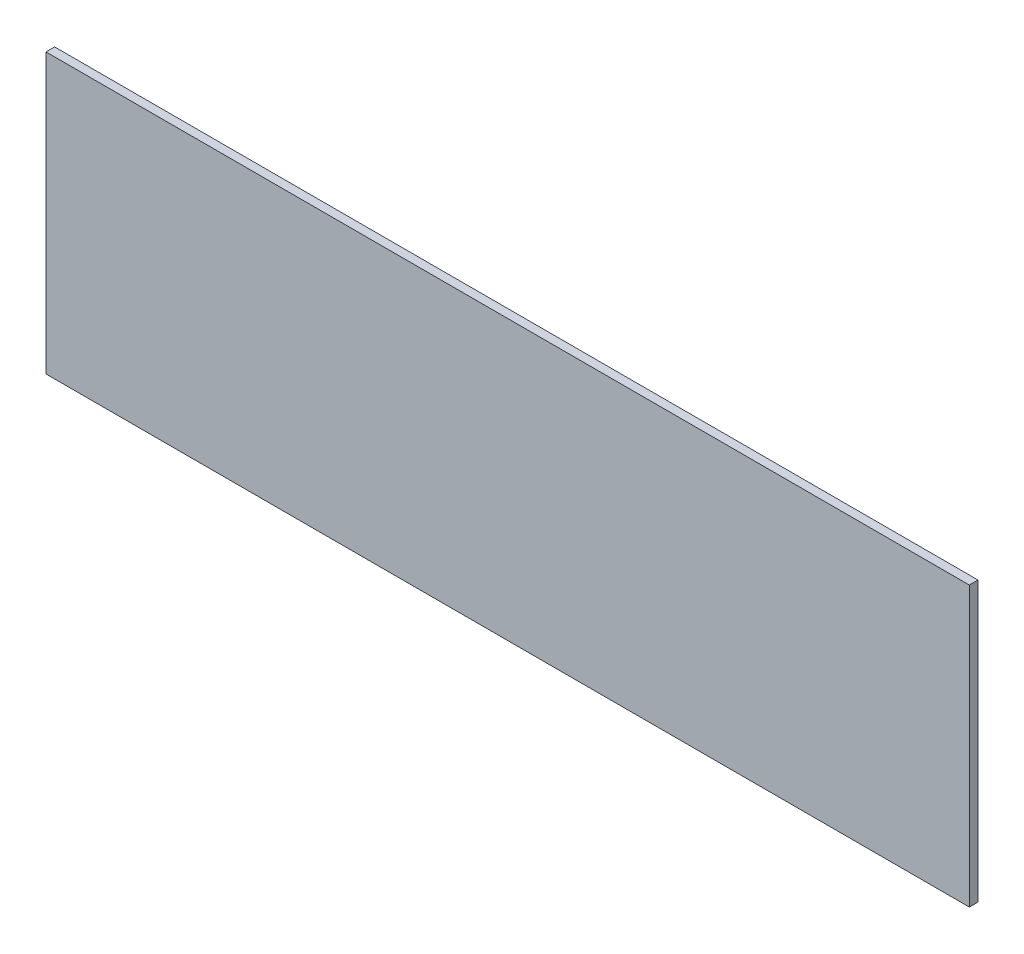
ISO-10303-21;
HEADER;
FILE_DESCRIPTION(('STEP AP214'),'2;1');
FILE_NAME('part.step','',(''),(''),'','','');
FILE_SCHEMA(('AUTOMOTIVE_DESIGN { 1 0 10303 214 1 1 1 1 }'));
ENDSEC;
DATA;
#1=APPLICATION_CONTEXT('core data for automotive mechanical design processes');
#2=APPLICATION_PROTOCOL_DEFINITION('international standard','automotive_design',2000,#1);
#3=PRODUCT_CONTEXT('',#1,'mechanical');
#4=PRODUCT('Part','Part','',(#3));
#5=PRODUCT_RELATED_PRODUCT_CATEGORY('part','',(#4));
#6=PRODUCT_DEFINITION_FORMATION('','',#4);
#7=PRODUCT_DEFINITION_CONTEXT('part definition',#1,'design');
#8=PRODUCT_DEFINITION('design','',#6,#7);
#9=PRODUCT_DEFINITION_SHAPE('','',#8);
#10=(LENGTH_UNIT() NAMED_UNIT(*) SI_UNIT(.MILLI.,.METRE.));
#11=(NAMED_UNIT(*) PLANE_ANGLE_UNIT() SI_UNIT($,.RADIAN.));
#12=(NAMED_UNIT(*) SI_UNIT($,.STERADIAN.) SOLID_ANGLE_UNIT());
#13=UNCERTAINTY_MEASURE_WITH_UNIT(LENGTH_MEASURE(1.E-05),#10,'distance_accuracy_value','');
#14=(GEOMETRIC_REPRESENTATION_CONTEXT(3) GLOBAL_UNCERTAINTY_ASSIGNED_CONTEXT((#13)) GLOBAL_UNIT_ASSIGNED_CONTEXT((#10,
#11,#12)) REPRESENTATION_CONTEXT('',''));
#15=CARTESIAN_POINT('',(0.,0.,0.));
#16=DIRECTION('',(0.,0.,1.));
#17=DIRECTION('',(1.,0.,0.));
#18=AXIS2_PLACEMENT_3D('',#15,#16,#17);
#19=CARTESIAN_POINT('',(480.,-145.,9.));
#20=DIRECTION('',(-1.,0.,0.));
#21=DIRECTION('',(0.,0.,1.));
#22=AXIS2_PLACEMENT_3D('',#19,#20,#21);
#23=PLANE('',#22);
#24=DIRECTION('',(0.,1.,0.));
#25=VECTOR('',#24,1.);
#26=CARTESIAN_POINT('',(480.,-145.,0.));
#27=LINE('',#26,#25);
#28=CARTESIAN_POINT('',(480.,-145.,0.));
#29=VERTEX_POINT('',#28);
#30=CARTESIAN_POINT('',(480.,145.,0.));
#31=VERTEX_POINT('',#30);
#32=EDGE_CURVE('E96',#29,#31,#27,.T.);
#33=ORIENTED_EDGE('',*,*,#32,.T.);
#34=DIRECTION('',(0.,0.,-1.));
#35=VECTOR('',#34,1.);
#36=CARTESIAN_POINT('',(480.,145.,9.));
#37=LINE('',#36,#35);
#38=CARTESIAN_POINT('',(480.,145.,9.));
#39=VERTEX_POINT('',#38);
#40=EDGE_CURVE('E11',#39,#31,#37,.T.);
#41=ORIENTED_EDGE('',*,*,#40,.F.);
#42=DIRECTION('',(0.,1.,0.));
#43=VECTOR('',#42,1.);
#44=CARTESIAN_POINT('',(480.,-145.,9.));
#45=LINE('',#44,#43);
#46=CARTESIAN_POINT('',(480.,-145.,9.));
#47=VERTEX_POINT('',#46);
#48=EDGE_CURVE('E84',#47,#39,#45,.T.);
#49=ORIENTED_EDGE('',*,*,#48,.F.);
#50=DIRECTION('',(0.,0.,-1.));
#51=VECTOR('',#50,1.);
#52=CARTESIAN_POINT('',(480.,-145.,9.));
#53=LINE('',#52,#51);
#54=EDGE_CURVE('E92',#47,#29,#53,.T.);
#55=ORIENTED_EDGE('',*,*,#54,.T.);
#56=EDGE_LOOP('',(#33,#41,#49,#55));
#57=FACE_BOUND('',#56,.T.);
#58=ADVANCED_FACE('F33',(#57),#23,.F.);
#59=CARTESIAN_POINT('',(-480.,145.,9.));
#60=DIRECTION('',(0.,-1.,0.));
#61=DIRECTION('',(0.,0.,-1.));
#62=AXIS2_PLACEMENT_3D('',#59,#60,#61);
#63=PLANE('',#62);
#64=DIRECTION('',(-1.,0.,0.));
#65=VECTOR('',#64,1.);
#66=CARTESIAN_POINT('',(-480.,145.,0.));
#67=LINE('',#66,#65);
#68=CARTESIAN_POINT('',(-480.,145.,0.));
#69=VERTEX_POINT('',#68);
#70=EDGE_CURVE('E88',#31,#69,#67,.T.);
#71=ORIENTED_EDGE('',*,*,#70,.T.);
#72=DIRECTION('',(0.,0.,-1.));
#73=VECTOR('',#72,1.);
#74=CARTESIAN_POINT('',(-480.,145.,9.));
#75=LINE('',#74,#73);
#76=CARTESIAN_POINT('',(-480.,145.,9.));
#77=VERTEX_POINT('',#76);
#78=EDGE_CURVE('E41',#77,#69,#75,.T.);
#79=ORIENTED_EDGE('',*,*,#78,.F.);
#80=DIRECTION('',(-1.,0.,0.));
#81=VECTOR('',#80,1.);
#82=CARTESIAN_POINT('',(-480.,145.,9.));
#83=LINE('',#82,#81);
#84=EDGE_CURVE('E79',#39,#77,#83,.T.);
#85=ORIENTED_EDGE('',*,*,#84,.F.);
#86=ORIENTED_EDGE('',*,*,#40,.T.);
#87=EDGE_LOOP('',(#71,#79,#85,#86));
#88=FACE_BOUND('',#87,.T.);
#89=ADVANCED_FACE('F87',(#88),#63,.F.);
#90=CARTESIAN_POINT('',(-480.,-145.,9.));
#91=DIRECTION('',(1.,0.,0.));
#92=DIRECTION('',(0.,0.,-1.));
#93=AXIS2_PLACEMENT_3D('',#90,#91,#92);
#94=PLANE('',#93);
#95=DIRECTION('',(0.,-1.,0.));
#96=VECTOR('',#95,1.);
#97=CARTESIAN_POINT('',(-480.,-145.,0.));
#98=LINE('',#97,#96);
#99=CARTESIAN_POINT('',(-480.,-145.,0.));
#100=VERTEX_POINT('',#99);
#101=EDGE_CURVE('E66',#69,#100,#98,.T.);
#102=ORIENTED_EDGE('',*,*,#101,.T.);
#103=DIRECTION('',(0.,0.,-1.));
#104=VECTOR('',#103,1.);
#105=CARTESIAN_POINT('',(-480.,-145.,9.));
#106=LINE('',#105,#104);
#107=CARTESIAN_POINT('',(-480.,-145.,9.));
#108=VERTEX_POINT('',#107);
#109=EDGE_CURVE('E89',#108,#100,#106,.T.);
#110=ORIENTED_EDGE('',*,*,#109,.F.);
#111=DIRECTION('',(0.,-1.,0.));
#112=VECTOR('',#111,1.);
#113=CARTESIAN_POINT('',(-480.,-145.,9.));
#114=LINE('',#113,#112);
#115=EDGE_CURVE('E82',#77,#108,#114,.T.);
#116=ORIENTED_EDGE('',*,*,#115,.F.);
#117=ORIENTED_EDGE('',*,*,#78,.T.);
#118=EDGE_LOOP('',(#102,#110,#116,#117));
#119=FACE_BOUND('',#118,.T.);
#120=ADVANCED_FACE('F90',(#119),#94,.F.);
#121=CARTESIAN_POINT('',(-480.,-145.,9.));
#122=DIRECTION('',(0.,1.,0.));
#123=DIRECTION('',(0.,0.,1.));
#124=AXIS2_PLACEMENT_3D('',#121,#122,#123);
#125=PLANE('',#124);
#126=DIRECTION('',(1.,0.,0.));
#127=VECTOR('',#126,1.);
#128=CARTESIAN_POINT('',(-480.,-145.,0.));
#129=LINE('',#128,#127);
#130=EDGE_CURVE('E72',#100,#29,#129,.T.);
#131=ORIENTED_EDGE('',*,*,#130,.T.);
#132=ORIENTED_EDGE('',*,*,#54,.F.);
#133=DIRECTION('',(1.,0.,0.));
#134=VECTOR('',#133,1.);
#135=CARTESIAN_POINT('',(-480.,-145.,9.));
#136=LINE('',#135,#134);
#137=EDGE_CURVE('E49',#108,#47,#136,.T.);
#138=ORIENTED_EDGE('',*,*,#137,.F.);
#139=ORIENTED_EDGE('',*,*,#109,.T.);
#140=EDGE_LOOP('',(#131,#132,#138,#139));
#141=FACE_BOUND('',#140,.T.);
#142=ADVANCED_FACE('F103',(#141),#125,.F.);
#143=CARTESIAN_POINT('',(0.,0.,9.));
#144=DIRECTION('',(0.,0.,-1.));
#145=DIRECTION('',(-1.,0.,0.));
#146=AXIS2_PLACEMENT_3D('',#143,#144,#145);
#147=PLANE('',#146);
#148=ORIENTED_EDGE('',*,*,#48,.T.);
#149=ORIENTED_EDGE('',*,*,#84,.T.);
#150=ORIENTED_EDGE('',*,*,#115,.T.);
#151=ORIENTED_EDGE('',*,*,#137,.T.);
#152=EDGE_LOOP('',(#148,#149,#150,#151));
#153=FACE_BOUND('',#152,.T.);
#154=ADVANCED_FACE('F80',(#153),#147,.F.);
#155=CARTESIAN_POINT('',(0.,0.,0.));
#156=DIRECTION('',(0.,0.,-1.));
#157=DIRECTION('',(-1.,0.,0.));
#158=AXIS2_PLACEMENT_3D('',#155,#156,#157);
#159=PLANE('',#158);
#160=ORIENTED_EDGE('',*,*,#32,.F.);
#161=ORIENTED_EDGE('',*,*,#130,.F.);
#162=ORIENTED_EDGE('',*,*,#101,.F.);
#163=ORIENTED_EDGE('',*,*,#70,.F.);
#164=EDGE_LOOP('',(#160,#161,#162,#163));
#165=FACE_BOUND('',#164,.T.);
#166=ADVANCED_FACE('F106',(#165),#159,.T.);
#167=CLOSED_SHELL('',(#58,#89,#120,#142,#154,#166));
#168=MANIFOLD_SOLID_BREP('B2',#167);
#169=ADVANCED_BREP_SHAPE_REPRESENTATION('',(#18,#168),#14);
#170=SHAPE_DEFINITION_REPRESENTATION(#9,#169);
ENDSEC;
END-ISO-10303-21;
